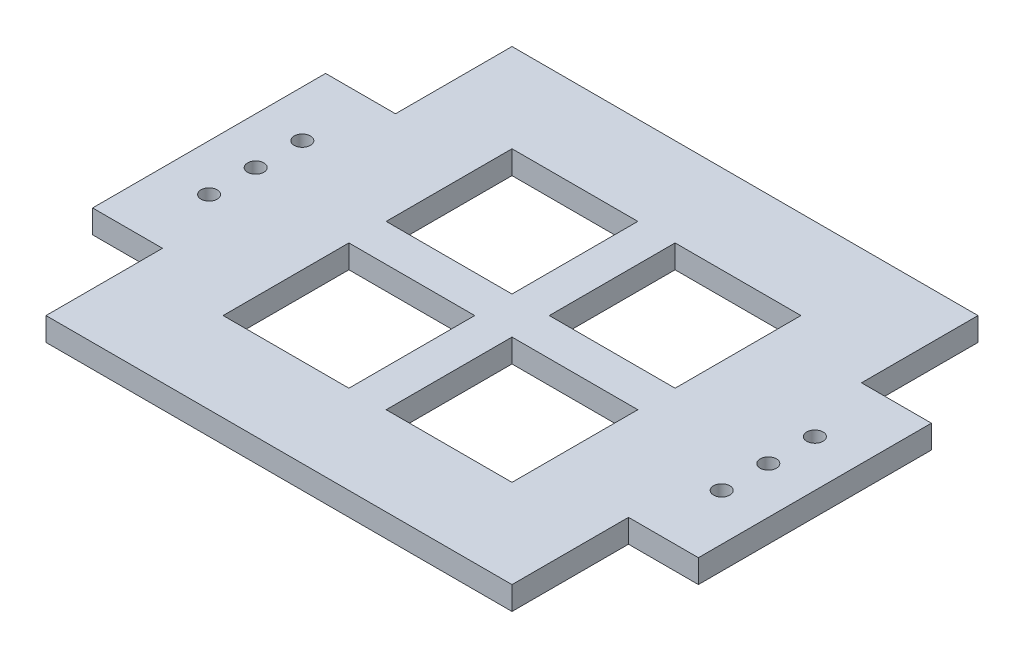
ISO-10303-21;
HEADER;
FILE_DESCRIPTION(('STEP AP214'),'2;1');
FILE_NAME('part.step','',(''),(''),'','','');
FILE_SCHEMA(('AUTOMOTIVE_DESIGN { 1 0 10303 214 1 1 1 1 }'));
ENDSEC;
DATA;
#1=APPLICATION_CONTEXT('core data for automotive mechanical design processes');
#2=APPLICATION_PROTOCOL_DEFINITION('international standard','automotive_design',2000,#1);
#3=PRODUCT_CONTEXT('',#1,'mechanical');
#4=PRODUCT('Part','Part','',(#3));
#5=PRODUCT_RELATED_PRODUCT_CATEGORY('part','',(#4));
#6=PRODUCT_DEFINITION_FORMATION('','',#4);
#7=PRODUCT_DEFINITION_CONTEXT('part definition',#1,'design');
#8=PRODUCT_DEFINITION('design','',#6,#7);
#9=PRODUCT_DEFINITION_SHAPE('','',#8);
#10=(LENGTH_UNIT() NAMED_UNIT(*) SI_UNIT(.MILLI.,.METRE.));
#11=(NAMED_UNIT(*) PLANE_ANGLE_UNIT() SI_UNIT($,.RADIAN.));
#12=(NAMED_UNIT(*) SI_UNIT($,.STERADIAN.) SOLID_ANGLE_UNIT());
#13=UNCERTAINTY_MEASURE_WITH_UNIT(LENGTH_MEASURE(1.E-05),#10,'distance_accuracy_value','');
#14=(GEOMETRIC_REPRESENTATION_CONTEXT(3) GLOBAL_UNCERTAINTY_ASSIGNED_CONTEXT((#13)) GLOBAL_UNIT_ASSIGNED_CONTEXT((#10,
#11,#12)) REPRESENTATION_CONTEXT('',''));
#15=CARTESIAN_POINT('',(0.,0.,0.));
#16=DIRECTION('',(0.,0.,1.));
#17=DIRECTION('',(1.,0.,0.));
#18=AXIS2_PLACEMENT_3D('',#15,#16,#17);
#19=CARTESIAN_POINT('',(0.,5.,0.));
#20=DIRECTION('',(0.,-1.,0.));
#21=DIRECTION('',(0.,0.,-1.));
#22=AXIS2_PLACEMENT_3D('',#19,#20,#21);
#23=PLANE('',#22);
#24=DIRECTION('',(0.,0.,-1.));
#25=VECTOR('',#24,1.);
#26=CARTESIAN_POINT('',(69.,5.,0.));
#27=LINE('',#26,#25);
#28=CARTESIAN_POINT('',(69.,5.,-19.));
#29=VERTEX_POINT('',#28);
#30=CARTESIAN_POINT('',(69.,5.,-46.));
#31=VERTEX_POINT('',#30);
#32=EDGE_CURVE('E285',#29,#31,#27,.T.);
#33=ORIENTED_EDGE('',*,*,#32,.T.);
#34=DIRECTION('',(1.,0.,0.));
#35=VECTOR('',#34,1.);
#36=CARTESIAN_POINT('',(0.,5.,-46.));
#37=LINE('',#36,#35);
#38=CARTESIAN_POINT('',(96.,5.,-46.));
#39=VERTEX_POINT('',#38);
#40=EDGE_CURVE('E340',#31,#39,#37,.T.);
#41=ORIENTED_EDGE('',*,*,#40,.T.);
#42=DIRECTION('',(0.,0.,-1.));
#43=VECTOR('',#42,1.);
#44=CARTESIAN_POINT('',(96.,5.,0.));
#45=LINE('',#44,#43);
#46=CARTESIAN_POINT('',(96.,5.,-19.));
#47=VERTEX_POINT('',#46);
#48=EDGE_CURVE('E354',#47,#39,#45,.T.);
#49=ORIENTED_EDGE('',*,*,#48,.F.);
#50=DIRECTION('',(1.,0.,0.));
#51=VECTOR('',#50,1.);
#52=CARTESIAN_POINT('',(0.,5.,-19.));
#53=LINE('',#52,#51);
#54=EDGE_CURVE('E351',#29,#47,#53,.T.);
#55=ORIENTED_EDGE('',*,*,#54,.F.);
#56=EDGE_LOOP('',(#33,#41,#49,#55));
#57=FACE_BOUND('',#56,.T.);
#58=CARTESIAN_POINT('',(155.,5.,-50.));
#59=DIRECTION('',(0.,1.,0.));
#60=DIRECTION('',(0.,0.,1.));
#61=AXIS2_PLACEMENT_3D('',#58,#59,#60);
#62=CIRCLE('',#61,1.75000000000001);
#63=CARTESIAN_POINT('',(155.,5.,-48.25));
#64=VERTEX_POINT('',#63);
#65=EDGE_CURVE('E433',#64,#64,#62,.T.);
#66=ORIENTED_EDGE('',*,*,#65,.F.);
#67=EDGE_LOOP('',(#66));
#68=FACE_BOUND('',#67,.T.);
#69=CARTESIAN_POINT('',(45.,5.,-50.));
#70=DIRECTION('',(0.,1.,0.));
#71=DIRECTION('',(0.,0.,1.));
#72=AXIS2_PLACEMENT_3D('',#69,#70,#71);
#73=CIRCLE('',#72,1.75);
#74=CARTESIAN_POINT('',(45.,5.,-48.25));
#75=VERTEX_POINT('',#74);
#76=EDGE_CURVE('E427',#75,#75,#73,.T.);
#77=ORIENTED_EDGE('',*,*,#76,.F.);
#78=EDGE_LOOP('',(#77));
#79=FACE_BOUND('',#78,.T.);
#80=CARTESIAN_POINT('',(45.,5.,-40.));
#81=DIRECTION('',(0.,-1.,0.));
#82=DIRECTION('',(0.,0.,-1.));
#83=AXIS2_PLACEMENT_3D('',#80,#81,#82);
#84=CIRCLE('',#83,1.75000000000001);
#85=CARTESIAN_POINT('',(45.,5.,-41.75));
#86=VERTEX_POINT('',#85);
#87=EDGE_CURVE('E460',#86,#86,#84,.T.);
#88=ORIENTED_EDGE('',*,*,#87,.T.);
#89=EDGE_LOOP('',(#88));
#90=FACE_BOUND('',#89,.T.);
#91=CARTESIAN_POINT('',(155.,5.,-40.));
#92=DIRECTION('',(0.,1.,0.));
#93=DIRECTION('',(0.,0.,1.));
#94=AXIS2_PLACEMENT_3D('',#91,#92,#93);
#95=CIRCLE('',#94,1.75000000000001);
#96=CARTESIAN_POINT('',(155.,5.,-38.25));
#97=VERTEX_POINT('',#96);
#98=EDGE_CURVE('E441',#97,#97,#95,.T.);
#99=ORIENTED_EDGE('',*,*,#98,.F.);
#100=EDGE_LOOP('',(#99));
#101=FACE_BOUND('',#100,.T.);
#102=CARTESIAN_POINT('',(155.,5.,-60.));
#103=DIRECTION('',(0.,1.,0.));
#104=DIRECTION('',(0.,0.,1.));
#105=AXIS2_PLACEMENT_3D('',#102,#103,#104);
#106=CIRCLE('',#105,1.75000000000001);
#107=CARTESIAN_POINT('',(155.,5.,-58.25));
#108=VERTEX_POINT('',#107);
#109=EDGE_CURVE('E448',#108,#108,#106,.F.);
#110=ORIENTED_EDGE('',*,*,#109,.T.);
#111=EDGE_LOOP('',(#110));
#112=FACE_BOUND('',#111,.T.);
#113=CARTESIAN_POINT('',(45.,5.,-60.));
#114=DIRECTION('',(0.,1.,0.));
#115=DIRECTION('',(0.,0.,1.));
#116=AXIS2_PLACEMENT_3D('',#113,#114,#115);
#117=CIRCLE('',#116,1.75000000000001);
#118=CARTESIAN_POINT('',(45.,5.,-58.25));
#119=VERTEX_POINT('',#118);
#120=EDGE_CURVE('E454',#119,#119,#117,.T.);
#121=ORIENTED_EDGE('',*,*,#120,.F.);
#122=EDGE_LOOP('',(#121));
#123=FACE_BOUND('',#122,.T.);
#124=DIRECTION('',(0.,0.,-1.));
#125=VECTOR('',#124,1.);
#126=CARTESIAN_POINT('',(104.,5.,0.));
#127=LINE('',#126,#125);
#128=CARTESIAN_POINT('',(104.,5.,-19.));
#129=VERTEX_POINT('',#128);
#130=CARTESIAN_POINT('',(104.,5.,-46.));
#131=VERTEX_POINT('',#130);
#132=EDGE_CURVE('E271',#129,#131,#127,.T.);
#133=ORIENTED_EDGE('',*,*,#132,.T.);
#134=DIRECTION('',(-1.,0.,0.));
#135=VECTOR('',#134,1.);
#136=CARTESIAN_POINT('',(0.,5.,-46.));
#137=LINE('',#136,#135);
#138=CARTESIAN_POINT('',(131.,5.,-46.));
#139=VERTEX_POINT('',#138);
#140=EDGE_CURVE('E262',#139,#131,#137,.T.);
#141=ORIENTED_EDGE('',*,*,#140,.F.);
#142=DIRECTION('',(0.,0.,-1.));
#143=VECTOR('',#142,1.);
#144=CARTESIAN_POINT('',(131.,5.,0.));
#145=LINE('',#144,#143);
#146=CARTESIAN_POINT('',(131.,5.,-19.));
#147=VERTEX_POINT('',#146);
#148=EDGE_CURVE('E278',#147,#139,#145,.T.);
#149=ORIENTED_EDGE('',*,*,#148,.F.);
#150=DIRECTION('',(-1.,0.,0.));
#151=VECTOR('',#150,1.);
#152=CARTESIAN_POINT('',(0.,5.,-19.));
#153=LINE('',#152,#151);
#154=EDGE_CURVE('E274',#147,#129,#153,.T.);
#155=ORIENTED_EDGE('',*,*,#154,.T.);
#156=EDGE_LOOP('',(#133,#141,#149,#155));
#157=FACE_BOUND('',#156,.T.);
#158=DIRECTION('',(1.,0.,0.));
#159=VECTOR('',#158,1.);
#160=CARTESIAN_POINT('',(0.,5.,-54.));
#161=LINE('',#160,#159);
#162=CARTESIAN_POINT('',(69.,5.,-54.));
#163=VERTEX_POINT('',#162);
#164=CARTESIAN_POINT('',(96.,5.,-54.));
#165=VERTEX_POINT('',#164);
#166=EDGE_CURVE('E399',#163,#165,#161,.T.);
#167=ORIENTED_EDGE('',*,*,#166,.F.);
#168=DIRECTION('',(0.,0.,1.));
#169=VECTOR('',#168,1.);
#170=CARTESIAN_POINT('',(69.,5.,0.));
#171=LINE('',#170,#169);
#172=CARTESIAN_POINT('',(69.,5.,-81.));
#173=VERTEX_POINT('',#172);
#174=EDGE_CURVE('E330',#173,#163,#171,.T.);
#175=ORIENTED_EDGE('',*,*,#174,.F.);
#176=DIRECTION('',(1.,0.,0.));
#177=VECTOR('',#176,1.);
#178=CARTESIAN_POINT('',(0.,5.,-81.));
#179=LINE('',#178,#177);
#180=CARTESIAN_POINT('',(96.,5.,-81.));
#181=VERTEX_POINT('',#180);
#182=EDGE_CURVE('E389',#173,#181,#179,.T.);
#183=ORIENTED_EDGE('',*,*,#182,.T.);
#184=DIRECTION('',(0.,0.,1.));
#185=VECTOR('',#184,1.);
#186=CARTESIAN_POINT('',(96.,5.,0.));
#187=LINE('',#186,#185);
#188=EDGE_CURVE('E402',#181,#165,#187,.T.);
#189=ORIENTED_EDGE('',*,*,#188,.T.);
#190=EDGE_LOOP('',(#167,#175,#183,#189));
#191=FACE_BOUND('',#190,.T.);
#192=DIRECTION('',(0.,0.,1.));
#193=VECTOR('',#192,1.);
#194=CARTESIAN_POINT('',(131.,5.,0.));
#195=LINE('',#194,#193);
#196=CARTESIAN_POINT('',(131.,5.,-81.));
#197=VERTEX_POINT('',#196);
#198=CARTESIAN_POINT('',(131.,5.,-54.));
#199=VERTEX_POINT('',#198);
#200=EDGE_CURVE('E315',#197,#199,#195,.T.);
#201=ORIENTED_EDGE('',*,*,#200,.T.);
#202=DIRECTION('',(-1.,0.,0.));
#203=VECTOR('',#202,1.);
#204=CARTESIAN_POINT('',(0.,5.,-54.));
#205=LINE('',#204,#203);
#206=CARTESIAN_POINT('',(104.,5.,-54.));
#207=VERTEX_POINT('',#206);
#208=EDGE_CURVE('E306',#199,#207,#205,.T.);
#209=ORIENTED_EDGE('',*,*,#208,.T.);
#210=DIRECTION('',(0.,0.,1.));
#211=VECTOR('',#210,1.);
#212=CARTESIAN_POINT('',(104.,5.,0.));
#213=LINE('',#212,#211);
#214=CARTESIAN_POINT('',(104.,5.,-81.));
#215=VERTEX_POINT('',#214);
#216=EDGE_CURVE('E322',#215,#207,#213,.T.);
#217=ORIENTED_EDGE('',*,*,#216,.F.);
#218=DIRECTION('',(-1.,0.,0.));
#219=VECTOR('',#218,1.);
#220=CARTESIAN_POINT('',(0.,5.,-81.));
#221=LINE('',#220,#219);
#222=EDGE_CURVE('E318',#197,#215,#221,.T.);
#223=ORIENTED_EDGE('',*,*,#222,.F.);
#224=EDGE_LOOP('',(#201,#209,#217,#223));
#225=FACE_BOUND('',#224,.T.);
#226=DIRECTION('',(0.,0.,-1.));
#227=VECTOR('',#226,1.);
#228=CARTESIAN_POINT('',(165.,5.,0.));
#229=LINE('',#228,#227);
#230=CARTESIAN_POINT('',(165.,5.,-25.));
#231=VERTEX_POINT('',#230);
#232=CARTESIAN_POINT('',(165.,5.,-75.));
#233=VERTEX_POINT('',#232);
#234=EDGE_CURVE('E54',#231,#233,#229,.T.);
#235=ORIENTED_EDGE('',*,*,#234,.T.);
#236=DIRECTION('',(-1.,0.,0.));
#237=VECTOR('',#236,1.);
#238=CARTESIAN_POINT('',(0.,5.,-75.));
#239=LINE('',#238,#237);
#240=CARTESIAN_POINT('',(150.,5.,-75.));
#241=VERTEX_POINT('',#240);
#242=EDGE_CURVE('E294',#233,#241,#239,.T.);
#243=ORIENTED_EDGE('',*,*,#242,.T.);
#244=DIRECTION('',(0.,0.,1.));
#245=VECTOR('',#244,1.);
#246=CARTESIAN_POINT('',(150.,5.,0.));
#247=LINE('',#246,#245);
#248=CARTESIAN_POINT('',(150.,5.,-100.));
#249=VERTEX_POINT('',#248);
#250=EDGE_CURVE('E257',#249,#241,#247,.T.);
#251=ORIENTED_EDGE('',*,*,#250,.F.);
#252=DIRECTION('',(-1.,0.,0.));
#253=VECTOR('',#252,1.);
#254=CARTESIAN_POINT('',(0.,5.,-100.));
#255=LINE('',#254,#253);
#256=CARTESIAN_POINT('',(50.,5.,-100.));
#257=VERTEX_POINT('',#256);
#258=EDGE_CURVE('E11',#249,#257,#255,.T.);
#259=ORIENTED_EDGE('',*,*,#258,.T.);
#260=DIRECTION('',(0.,0.,1.));
#261=VECTOR('',#260,1.);
#262=CARTESIAN_POINT('',(50.,5.,0.));
#263=LINE('',#262,#261);
#264=CARTESIAN_POINT('',(50.,5.,-75.));
#265=VERTEX_POINT('',#264);
#266=EDGE_CURVE('E374',#257,#265,#263,.T.);
#267=ORIENTED_EDGE('',*,*,#266,.T.);
#268=DIRECTION('',(1.,0.,0.));
#269=VECTOR('',#268,1.);
#270=CARTESIAN_POINT('',(0.,5.,-75.));
#271=LINE('',#270,#269);
#272=CARTESIAN_POINT('',(35.,5.,-75.));
#273=VERTEX_POINT('',#272);
#274=EDGE_CURVE('E371',#273,#265,#271,.T.);
#275=ORIENTED_EDGE('',*,*,#274,.F.);
#276=DIRECTION('',(0.,0.,-1.));
#277=VECTOR('',#276,1.);
#278=CARTESIAN_POINT('',(35.,5.,0.));
#279=LINE('',#278,#277);
#280=CARTESIAN_POINT('',(35.,5.,-25.));
#281=VERTEX_POINT('',#280);
#282=EDGE_CURVE('E488',#281,#273,#279,.T.);
#283=ORIENTED_EDGE('',*,*,#282,.F.);
#284=DIRECTION('',(1.,0.,0.));
#285=VECTOR('',#284,1.);
#286=CARTESIAN_POINT('',(0.,5.,-25.));
#287=LINE('',#286,#285);
#288=CARTESIAN_POINT('',(50.,5.,-25.));
#289=VERTEX_POINT('',#288);
#290=EDGE_CURVE('E382',#281,#289,#287,.T.);
#291=ORIENTED_EDGE('',*,*,#290,.T.);
#292=DIRECTION('',(0.,0.,-1.));
#293=VECTOR('',#292,1.);
#294=CARTESIAN_POINT('',(50.,5.,0.));
#295=LINE('',#294,#293);
#296=CARTESIAN_POINT('',(50.,5.,0.));
#297=VERTEX_POINT('',#296);
#298=EDGE_CURVE('E417',#297,#289,#295,.T.);
#299=ORIENTED_EDGE('',*,*,#298,.F.);
#300=DIRECTION('',(1.,0.,0.));
#301=VECTOR('',#300,1.);
#302=CARTESIAN_POINT('',(0.,5.,0.));
#303=LINE('',#302,#301);
#304=CARTESIAN_POINT('',(150.,5.,0.));
#305=VERTEX_POINT('',#304);
#306=EDGE_CURVE('E46',#297,#305,#303,.T.);
#307=ORIENTED_EDGE('',*,*,#306,.T.);
#308=DIRECTION('',(0.,0.,-1.));
#309=VECTOR('',#308,1.);
#310=CARTESIAN_POINT('',(150.,5.,0.));
#311=LINE('',#310,#309);
#312=CARTESIAN_POINT('',(150.,5.,-25.));
#313=VERTEX_POINT('',#312);
#314=EDGE_CURVE('E253',#305,#313,#311,.T.);
#315=ORIENTED_EDGE('',*,*,#314,.T.);
#316=DIRECTION('',(-1.,0.,0.));
#317=VECTOR('',#316,1.);
#318=CARTESIAN_POINT('',(0.,5.,-25.));
#319=LINE('',#318,#317);
#320=EDGE_CURVE('E249',#231,#313,#319,.T.);
#321=ORIENTED_EDGE('',*,*,#320,.F.);
#322=EDGE_LOOP('',(#235,#243,#251,#259,#267,#275,#283,#291,#299,#307,#315,#321));
#323=FACE_BOUND('',#322,.T.);
#324=ADVANCED_FACE('F37',(#57,#68,#79,#90,#101,#112,#123,#157,#191,#225,#323),#23,.F.);
#325=CARTESIAN_POINT('',(0.,0.,0.));
#326=DIRECTION('',(0.,-1.,0.));
#327=DIRECTION('',(0.,0.,-1.));
#328=AXIS2_PLACEMENT_3D('',#325,#326,#327);
#329=PLANE('',#328);
#330=DIRECTION('',(1.,0.,0.));
#331=VECTOR('',#330,1.);
#332=CARTESIAN_POINT('',(0.,0.,-46.));
#333=LINE('',#332,#331);
#334=CARTESIAN_POINT('',(69.,0.,-46.));
#335=VERTEX_POINT('',#334);
#336=CARTESIAN_POINT('',(96.,0.,-46.));
#337=VERTEX_POINT('',#336);
#338=EDGE_CURVE('E346',#335,#337,#333,.T.);
#339=ORIENTED_EDGE('',*,*,#338,.F.);
#340=DIRECTION('',(0.,0.,-1.));
#341=VECTOR('',#340,1.);
#342=CARTESIAN_POINT('',(69.,0.,0.));
#343=LINE('',#342,#341);
#344=CARTESIAN_POINT('',(69.,0.,-19.));
#345=VERTEX_POINT('',#344);
#346=EDGE_CURVE('E337',#345,#335,#343,.T.);
#347=ORIENTED_EDGE('',*,*,#346,.F.);
#348=DIRECTION('',(1.,0.,0.));
#349=VECTOR('',#348,1.);
#350=CARTESIAN_POINT('',(0.,0.,-19.));
#351=LINE('',#350,#349);
#352=CARTESIAN_POINT('',(96.,0.,-19.));
#353=VERTEX_POINT('',#352);
#354=EDGE_CURVE('E339',#345,#353,#351,.T.);
#355=ORIENTED_EDGE('',*,*,#354,.T.);
#356=DIRECTION('',(0.,0.,-1.));
#357=VECTOR('',#356,1.);
#358=CARTESIAN_POINT('',(96.,0.,0.));
#359=LINE('',#358,#357);
#360=EDGE_CURVE('E343',#353,#337,#359,.T.);
#361=ORIENTED_EDGE('',*,*,#360,.T.);
#362=EDGE_LOOP('',(#339,#347,#355,#361));
#363=FACE_BOUND('',#362,.T.);
#364=DIRECTION('',(-1.,0.,0.));
#365=VECTOR('',#364,1.);
#366=CARTESIAN_POINT('',(0.,0.,-54.));
#367=LINE('',#366,#365);
#368=CARTESIAN_POINT('',(131.,0.,-54.));
#369=VERTEX_POINT('',#368);
#370=CARTESIAN_POINT('',(104.,0.,-54.));
#371=VERTEX_POINT('',#370);
#372=EDGE_CURVE('E312',#369,#371,#367,.T.);
#373=ORIENTED_EDGE('',*,*,#372,.F.);
#374=DIRECTION('',(0.,0.,1.));
#375=VECTOR('',#374,1.);
#376=CARTESIAN_POINT('',(131.,0.,0.));
#377=LINE('',#376,#375);
#378=CARTESIAN_POINT('',(131.,0.,-81.));
#379=VERTEX_POINT('',#378);
#380=EDGE_CURVE('E303',#379,#369,#377,.T.);
#381=ORIENTED_EDGE('',*,*,#380,.F.);
#382=DIRECTION('',(-1.,0.,0.));
#383=VECTOR('',#382,1.);
#384=CARTESIAN_POINT('',(0.,0.,-81.));
#385=LINE('',#384,#383);
#386=CARTESIAN_POINT('',(104.,0.,-81.));
#387=VERTEX_POINT('',#386);
#388=EDGE_CURVE('E305',#379,#387,#385,.T.);
#389=ORIENTED_EDGE('',*,*,#388,.T.);
#390=DIRECTION('',(0.,0.,1.));
#391=VECTOR('',#390,1.);
#392=CARTESIAN_POINT('',(104.,0.,0.));
#393=LINE('',#392,#391);
#394=EDGE_CURVE('E309',#387,#371,#393,.T.);
#395=ORIENTED_EDGE('',*,*,#394,.T.);
#396=EDGE_LOOP('',(#373,#381,#389,#395));
#397=FACE_BOUND('',#396,.T.);
#398=DIRECTION('',(-1.,0.,0.));
#399=VECTOR('',#398,1.);
#400=CARTESIAN_POINT('',(0.,0.,-46.));
#401=LINE('',#400,#399);
#402=CARTESIAN_POINT('',(131.,0.,-46.));
#403=VERTEX_POINT('',#402);
#404=CARTESIAN_POINT('',(104.,0.,-46.));
#405=VERTEX_POINT('',#404);
#406=EDGE_CURVE('E267',#403,#405,#401,.T.);
#407=ORIENTED_EDGE('',*,*,#406,.T.);
#408=DIRECTION('',(0.,0.,-1.));
#409=VECTOR('',#408,1.);
#410=CARTESIAN_POINT('',(104.,0.,0.));
#411=LINE('',#410,#409);
#412=CARTESIAN_POINT('',(104.,0.,-19.));
#413=VERTEX_POINT('',#412);
#414=EDGE_CURVE('E259',#413,#405,#411,.T.);
#415=ORIENTED_EDGE('',*,*,#414,.F.);
#416=DIRECTION('',(-1.,0.,0.));
#417=VECTOR('',#416,1.);
#418=CARTESIAN_POINT('',(0.,0.,-19.));
#419=LINE('',#418,#417);
#420=CARTESIAN_POINT('',(131.,0.,-19.));
#421=VERTEX_POINT('',#420);
#422=EDGE_CURVE('E261',#421,#413,#419,.T.);
#423=ORIENTED_EDGE('',*,*,#422,.F.);
#424=DIRECTION('',(0.,0.,-1.));
#425=VECTOR('',#424,1.);
#426=CARTESIAN_POINT('',(131.,0.,0.));
#427=LINE('',#426,#425);
#428=EDGE_CURVE('E264',#421,#403,#427,.T.);
#429=ORIENTED_EDGE('',*,*,#428,.T.);
#430=EDGE_LOOP('',(#407,#415,#423,#429));
#431=FACE_BOUND('',#430,.T.);
#432=CARTESIAN_POINT('',(45.,0.,-60.));
#433=DIRECTION('',(0.,1.,0.));
#434=DIRECTION('',(0.,0.,1.));
#435=AXIS2_PLACEMENT_3D('',#432,#433,#434);
#436=CIRCLE('',#435,1.75000000000001);
#437=CARTESIAN_POINT('',(45.,0.,-58.25));
#438=VERTEX_POINT('',#437);
#439=EDGE_CURVE('E457',#438,#438,#436,.T.);
#440=ORIENTED_EDGE('',*,*,#439,.T.);
#441=EDGE_LOOP('',(#440));
#442=FACE_BOUND('',#441,.T.);
#443=CARTESIAN_POINT('',(155.,0.,-40.));
#444=DIRECTION('',(0.,1.,0.));
#445=DIRECTION('',(0.,0.,1.));
#446=AXIS2_PLACEMENT_3D('',#443,#444,#445);
#447=CIRCLE('',#446,1.75000000000001);
#448=CARTESIAN_POINT('',(155.,0.,-38.25));
#449=VERTEX_POINT('',#448);
#450=EDGE_CURVE('E445',#449,#449,#447,.T.);
#451=ORIENTED_EDGE('',*,*,#450,.T.);
#452=EDGE_LOOP('',(#451));
#453=FACE_BOUND('',#452,.T.);
#454=CARTESIAN_POINT('',(155.,0.,-60.));
#455=DIRECTION('',(0.,1.,0.));
#456=DIRECTION('',(0.,0.,1.));
#457=AXIS2_PLACEMENT_3D('',#454,#455,#456);
#458=CIRCLE('',#457,1.75000000000001);
#459=CARTESIAN_POINT('',(155.,0.,-58.25));
#460=VERTEX_POINT('',#459);
#461=EDGE_CURVE('E451',#460,#460,#458,.F.);
#462=ORIENTED_EDGE('',*,*,#461,.F.);
#463=EDGE_LOOP('',(#462));
#464=FACE_BOUND('',#463,.T.);
#465=CARTESIAN_POINT('',(45.,0.,-40.));
#466=DIRECTION('',(0.,-1.,0.));
#467=DIRECTION('',(0.,0.,-1.));
#468=AXIS2_PLACEMENT_3D('',#465,#466,#467);
#469=CIRCLE('',#468,1.75000000000001);
#470=CARTESIAN_POINT('',(45.,0.,-41.75));
#471=VERTEX_POINT('',#470);
#472=EDGE_CURVE('E432',#471,#471,#469,.T.);
#473=ORIENTED_EDGE('',*,*,#472,.F.);
#474=EDGE_LOOP('',(#473));
#475=FACE_BOUND('',#474,.T.);
#476=CARTESIAN_POINT('',(45.,0.,-50.));
#477=DIRECTION('',(0.,1.,0.));
#478=DIRECTION('',(0.,0.,1.));
#479=AXIS2_PLACEMENT_3D('',#476,#477,#478);
#480=CIRCLE('',#479,1.75);
#481=CARTESIAN_POINT('',(45.,0.,-48.25));
#482=VERTEX_POINT('',#481);
#483=EDGE_CURVE('E436',#482,#482,#480,.T.);
#484=ORIENTED_EDGE('',*,*,#483,.T.);
#485=EDGE_LOOP('',(#484));
#486=FACE_BOUND('',#485,.T.);
#487=CARTESIAN_POINT('',(155.,0.,-50.));
#488=DIRECTION('',(0.,1.,0.));
#489=DIRECTION('',(0.,0.,1.));
#490=AXIS2_PLACEMENT_3D('',#487,#488,#489);
#491=CIRCLE('',#490,1.75000000000001);
#492=CARTESIAN_POINT('',(155.,0.,-48.25));
#493=VERTEX_POINT('',#492);
#494=EDGE_CURVE('E429',#493,#493,#491,.T.);
#495=ORIENTED_EDGE('',*,*,#494,.T.);
#496=EDGE_LOOP('',(#495));
#497=FACE_BOUND('',#496,.T.);
#498=DIRECTION('',(0.,0.,1.));
#499=VECTOR('',#498,1.);
#500=CARTESIAN_POINT('',(69.,0.,0.));
#501=LINE('',#500,#499);
#502=CARTESIAN_POINT('',(69.,0.,-81.));
#503=VERTEX_POINT('',#502);
#504=CARTESIAN_POINT('',(69.,0.,-54.));
#505=VERTEX_POINT('',#504);
#506=EDGE_CURVE('E385',#503,#505,#501,.T.);
#507=ORIENTED_EDGE('',*,*,#506,.T.);
#508=DIRECTION('',(1.,0.,0.));
#509=VECTOR('',#508,1.);
#510=CARTESIAN_POINT('',(0.,0.,-54.));
#511=LINE('',#510,#509);
#512=CARTESIAN_POINT('',(96.,0.,-54.));
#513=VERTEX_POINT('',#512);
#514=EDGE_CURVE('E388',#505,#513,#511,.T.);
#515=ORIENTED_EDGE('',*,*,#514,.T.);
#516=DIRECTION('',(0.,0.,1.));
#517=VECTOR('',#516,1.);
#518=CARTESIAN_POINT('',(96.,0.,0.));
#519=LINE('',#518,#517);
#520=CARTESIAN_POINT('',(96.,0.,-81.));
#521=VERTEX_POINT('',#520);
#522=EDGE_CURVE('E392',#521,#513,#519,.T.);
#523=ORIENTED_EDGE('',*,*,#522,.F.);
#524=DIRECTION('',(1.,0.,0.));
#525=VECTOR('',#524,1.);
#526=CARTESIAN_POINT('',(0.,0.,-81.));
#527=LINE('',#526,#525);
#528=EDGE_CURVE('E395',#503,#521,#527,.T.);
#529=ORIENTED_EDGE('',*,*,#528,.F.);
#530=EDGE_LOOP('',(#507,#515,#523,#529));
#531=FACE_BOUND('',#530,.T.);
#532=DIRECTION('',(-1.,0.,0.));
#533=VECTOR('',#532,1.);
#534=CARTESIAN_POINT('',(0.,0.,-75.));
#535=LINE('',#534,#533);
#536=CARTESIAN_POINT('',(165.,0.,-75.));
#537=VERTEX_POINT('',#536);
#538=CARTESIAN_POINT('',(150.,0.,-75.));
#539=VERTEX_POINT('',#538);
#540=EDGE_CURVE('E238',#537,#539,#535,.T.);
#541=ORIENTED_EDGE('',*,*,#540,.F.);
#542=DIRECTION('',(0.,0.,-1.));
#543=VECTOR('',#542,1.);
#544=CARTESIAN_POINT('',(165.,0.,0.));
#545=LINE('',#544,#543);
#546=CARTESIAN_POINT('',(165.,0.,-25.));
#547=VERTEX_POINT('',#546);
#548=EDGE_CURVE('E224',#547,#537,#545,.T.);
#549=ORIENTED_EDGE('',*,*,#548,.F.);
#550=DIRECTION('',(-1.,0.,0.));
#551=VECTOR('',#550,1.);
#552=CARTESIAN_POINT('',(0.,0.,-25.));
#553=LINE('',#552,#551);
#554=CARTESIAN_POINT('',(150.,0.,-25.));
#555=VERTEX_POINT('',#554);
#556=EDGE_CURVE('E235',#547,#555,#553,.T.);
#557=ORIENTED_EDGE('',*,*,#556,.T.);
#558=DIRECTION('',(0.,0.,-1.));
#559=VECTOR('',#558,1.);
#560=CARTESIAN_POINT('',(150.,0.,0.));
#561=LINE('',#560,#559);
#562=CARTESIAN_POINT('',(150.,0.,0.));
#563=VERTEX_POINT('',#562);
#564=EDGE_CURVE('E245',#563,#555,#561,.T.);
#565=ORIENTED_EDGE('',*,*,#564,.F.);
#566=DIRECTION('',(1.,0.,0.));
#567=VECTOR('',#566,1.);
#568=CARTESIAN_POINT('',(0.,0.,0.));
#569=LINE('',#568,#567);
#570=CARTESIAN_POINT('',(50.,0.,0.));
#571=VERTEX_POINT('',#570);
#572=EDGE_CURVE('E444',#571,#563,#569,.T.);
#573=ORIENTED_EDGE('',*,*,#572,.F.);
#574=DIRECTION('',(0.,0.,-1.));
#575=VECTOR('',#574,1.);
#576=CARTESIAN_POINT('',(50.,0.,0.));
#577=LINE('',#576,#575);
#578=CARTESIAN_POINT('',(50.,0.,-25.));
#579=VERTEX_POINT('',#578);
#580=EDGE_CURVE('E416',#571,#579,#577,.T.);
#581=ORIENTED_EDGE('',*,*,#580,.T.);
#582=DIRECTION('',(1.,0.,0.));
#583=VECTOR('',#582,1.);
#584=CARTESIAN_POINT('',(0.,0.,-25.));
#585=LINE('',#584,#583);
#586=CARTESIAN_POINT('',(35.,0.,-25.));
#587=VERTEX_POINT('',#586);
#588=EDGE_CURVE('E414',#587,#579,#585,.T.);
#589=ORIENTED_EDGE('',*,*,#588,.F.);
#590=DIRECTION('',(0.,0.,-1.));
#591=VECTOR('',#590,1.);
#592=CARTESIAN_POINT('',(35.,0.,0.));
#593=LINE('',#592,#591);
#594=CARTESIAN_POINT('',(35.,0.,-75.));
#595=VERTEX_POINT('',#594);
#596=EDGE_CURVE('E62',#587,#595,#593,.T.);
#597=ORIENTED_EDGE('',*,*,#596,.T.);
#598=DIRECTION('',(1.,0.,0.));
#599=VECTOR('',#598,1.);
#600=CARTESIAN_POINT('',(0.,0.,-75.));
#601=LINE('',#600,#599);
#602=CARTESIAN_POINT('',(50.,0.,-75.));
#603=VERTEX_POINT('',#602);
#604=EDGE_CURVE('E370',#595,#603,#601,.T.);
#605=ORIENTED_EDGE('',*,*,#604,.T.);
#606=DIRECTION('',(0.,0.,1.));
#607=VECTOR('',#606,1.);
#608=CARTESIAN_POINT('',(50.,0.,0.));
#609=LINE('',#608,#607);
#610=CARTESIAN_POINT('',(50.,0.,-100.));
#611=VERTEX_POINT('',#610);
#612=EDGE_CURVE('E367',#611,#603,#609,.T.);
#613=ORIENTED_EDGE('',*,*,#612,.F.);
#614=DIRECTION('',(-1.,0.,0.));
#615=VECTOR('',#614,1.);
#616=CARTESIAN_POINT('',(0.,0.,-100.));
#617=LINE('',#616,#615);
#618=CARTESIAN_POINT('',(150.,0.,-100.));
#619=VERTEX_POINT('',#618);
#620=EDGE_CURVE('E41',#619,#611,#617,.T.);
#621=ORIENTED_EDGE('',*,*,#620,.F.);
#622=DIRECTION('',(0.,0.,1.));
#623=VECTOR('',#622,1.);
#624=CARTESIAN_POINT('',(150.,0.,0.));
#625=LINE('',#624,#623);
#626=EDGE_CURVE('E292',#619,#539,#625,.T.);
#627=ORIENTED_EDGE('',*,*,#626,.T.);
#628=EDGE_LOOP('',(#541,#549,#557,#565,#573,#581,#589,#597,#605,#613,#621,#627));
#629=FACE_BOUND('',#628,.T.);
#630=ADVANCED_FACE('F233',(#363,#397,#431,#442,#453,#464,#475,#486,#497,#531,#629),#329,.T.);
#631=CARTESIAN_POINT('',(0.,0.,-75.));
#632=DIRECTION('',(0.,0.,-1.));
#633=DIRECTION('',(-1.,0.,0.));
#634=AXIS2_PLACEMENT_3D('',#631,#632,#633);
#635=PLANE('',#634);
#636=ORIENTED_EDGE('',*,*,#242,.F.);
#637=DIRECTION('',(0.,1.,0.));
#638=VECTOR('',#637,1.);
#639=CARTESIAN_POINT('',(165.,0.,-75.));
#640=LINE('',#639,#638);
#641=EDGE_CURVE('E229',#537,#233,#640,.T.);
#642=ORIENTED_EDGE('',*,*,#641,.F.);
#643=ORIENTED_EDGE('',*,*,#540,.T.);
#644=DIRECTION('',(0.,1.,0.));
#645=VECTOR('',#644,1.);
#646=CARTESIAN_POINT('',(150.,0.,-75.));
#647=LINE('',#646,#645);
#648=EDGE_CURVE('E275',#539,#241,#647,.T.);
#649=ORIENTED_EDGE('',*,*,#648,.T.);
#650=EDGE_LOOP('',(#636,#642,#643,#649));
#651=FACE_BOUND('',#650,.T.);
#652=ADVANCED_FACE('F496',(#651),#635,.T.);
#653=CARTESIAN_POINT('',(0.,0.,-25.));
#654=DIRECTION('',(0.,0.,-1.));
#655=DIRECTION('',(-1.,0.,0.));
#656=AXIS2_PLACEMENT_3D('',#653,#654,#655);
#657=PLANE('',#656);
#658=DIRECTION('',(0.,1.,0.));
#659=VECTOR('',#658,1.);
#660=CARTESIAN_POINT('',(165.,0.,-25.));
#661=LINE('',#660,#659);
#662=EDGE_CURVE('E221',#547,#231,#661,.T.);
#663=ORIENTED_EDGE('',*,*,#662,.T.);
#664=ORIENTED_EDGE('',*,*,#320,.T.);
#665=DIRECTION('',(0.,1.,0.));
#666=VECTOR('',#665,1.);
#667=CARTESIAN_POINT('',(150.,0.,-25.));
#668=LINE('',#667,#666);
#669=EDGE_CURVE('E243',#555,#313,#668,.T.);
#670=ORIENTED_EDGE('',*,*,#669,.F.);
#671=ORIENTED_EDGE('',*,*,#556,.F.);
#672=EDGE_LOOP('',(#663,#664,#670,#671));
#673=FACE_BOUND('',#672,.T.);
#674=ADVANCED_FACE('F241',(#673),#657,.F.);
#675=CARTESIAN_POINT('',(0.,5.,0.));
#676=DIRECTION('',(0.,0.,-1.));
#677=DIRECTION('',(-1.,0.,0.));
#678=AXIS2_PLACEMENT_3D('',#675,#676,#677);
#679=PLANE('',#678);
#680=DIRECTION('',(0.,1.,0.));
#681=VECTOR('',#680,1.);
#682=CARTESIAN_POINT('',(150.,0.,0.));
#683=LINE('',#682,#681);
#684=EDGE_CURVE('E244',#563,#305,#683,.T.);
#685=ORIENTED_EDGE('',*,*,#684,.T.);
#686=ORIENTED_EDGE('',*,*,#306,.F.);
#687=DIRECTION('',(0.,1.,0.));
#688=VECTOR('',#687,1.);
#689=CARTESIAN_POINT('',(50.,0.,0.));
#690=LINE('',#689,#688);
#691=EDGE_CURVE('E420',#571,#297,#690,.T.);
#692=ORIENTED_EDGE('',*,*,#691,.F.);
#693=ORIENTED_EDGE('',*,*,#572,.T.);
#694=EDGE_LOOP('',(#685,#686,#692,#693));
#695=FACE_BOUND('',#694,.T.);
#696=ADVANCED_FACE('F39',(#695),#679,.F.);
#697=CARTESIAN_POINT('',(0.,5.,-100.));
#698=DIRECTION('',(0.,0.,1.));
#699=DIRECTION('',(1.,0.,0.));
#700=AXIS2_PLACEMENT_3D('',#697,#698,#699);
#701=PLANE('',#700);
#702=DIRECTION('',(0.,1.,0.));
#703=VECTOR('',#702,1.);
#704=CARTESIAN_POINT('',(50.,0.,-100.));
#705=LINE('',#704,#703);
#706=EDGE_CURVE('E373',#611,#257,#705,.T.);
#707=ORIENTED_EDGE('',*,*,#706,.T.);
#708=ORIENTED_EDGE('',*,*,#258,.F.);
#709=DIRECTION('',(0.,1.,0.));
#710=VECTOR('',#709,1.);
#711=CARTESIAN_POINT('',(150.,0.,-100.));
#712=LINE('',#711,#710);
#713=EDGE_CURVE('E296',#619,#249,#712,.T.);
#714=ORIENTED_EDGE('',*,*,#713,.F.);
#715=ORIENTED_EDGE('',*,*,#620,.T.);
#716=EDGE_LOOP('',(#707,#708,#714,#715));
#717=FACE_BOUND('',#716,.T.);
#718=ADVANCED_FACE('F474',(#717),#701,.F.);
#719=CARTESIAN_POINT('',(155.,0.,-40.));
#720=DIRECTION('',(0.,1.,0.));
#721=DIRECTION('',(0.,0.,1.));
#722=AXIS2_PLACEMENT_3D('',#719,#720,#721);
#723=CYLINDRICAL_SURFACE('',#722,1.75000000000001);
#724=ORIENTED_EDGE('',*,*,#450,.F.);
#725=EDGE_LOOP('',(#724));
#726=FACE_BOUND('',#725,.T.);
#727=ORIENTED_EDGE('',*,*,#98,.T.);
#728=EDGE_LOOP('',(#727));
#729=FACE_BOUND('',#728,.T.);
#730=ADVANCED_FACE('F537',(#726,#729),#723,.F.);
#731=CARTESIAN_POINT('',(155.,0.,-60.));
#732=DIRECTION('',(0.,1.,0.));
#733=DIRECTION('',(0.,0.,1.));
#734=AXIS2_PLACEMENT_3D('',#731,#732,#733);
#735=CYLINDRICAL_SURFACE('',#734,1.75000000000001);
#736=ORIENTED_EDGE('',*,*,#461,.T.);
#737=EDGE_LOOP('',(#736));
#738=FACE_BOUND('',#737,.T.);
#739=ORIENTED_EDGE('',*,*,#109,.F.);
#740=EDGE_LOOP('',(#739));
#741=FACE_BOUND('',#740,.T.);
#742=ADVANCED_FACE('F542',(#738,#741),#735,.F.);
#743=CARTESIAN_POINT('',(45.,0.,-60.));
#744=DIRECTION('',(0.,1.,0.));
#745=DIRECTION('',(0.,0.,1.));
#746=AXIS2_PLACEMENT_3D('',#743,#744,#745);
#747=CYLINDRICAL_SURFACE('',#746,1.75000000000001);
#748=ORIENTED_EDGE('',*,*,#439,.F.);
#749=EDGE_LOOP('',(#748));
#750=FACE_BOUND('',#749,.T.);
#751=ORIENTED_EDGE('',*,*,#120,.T.);
#752=EDGE_LOOP('',(#751));
#753=FACE_BOUND('',#752,.T.);
#754=ADVANCED_FACE('F800',(#750,#753),#747,.F.);
#755=CARTESIAN_POINT('',(45.,0.,-40.));
#756=DIRECTION('',(0.,1.,0.));
#757=DIRECTION('',(0.,0.,1.));
#758=AXIS2_PLACEMENT_3D('',#755,#756,#757);
#759=CYLINDRICAL_SURFACE('',#758,1.75000000000001);
#760=ORIENTED_EDGE('',*,*,#472,.T.);
#761=EDGE_LOOP('',(#760));
#762=FACE_BOUND('',#761,.T.);
#763=ORIENTED_EDGE('',*,*,#87,.F.);
#764=EDGE_LOOP('',(#763));
#765=FACE_BOUND('',#764,.T.);
#766=ADVANCED_FACE('F534',(#762,#765),#759,.F.);
#767=CARTESIAN_POINT('',(45.,0.,-50.));
#768=DIRECTION('',(0.,1.,0.));
#769=DIRECTION('',(0.,0.,1.));
#770=AXIS2_PLACEMENT_3D('',#767,#768,#769);
#771=CYLINDRICAL_SURFACE('',#770,1.75);
#772=ORIENTED_EDGE('',*,*,#483,.F.);
#773=EDGE_LOOP('',(#772));
#774=FACE_BOUND('',#773,.T.);
#775=ORIENTED_EDGE('',*,*,#76,.T.);
#776=EDGE_LOOP('',(#775));
#777=FACE_BOUND('',#776,.T.);
#778=ADVANCED_FACE('F785',(#774,#777),#771,.F.);
#779=CARTESIAN_POINT('',(155.,0.,-50.));
#780=DIRECTION('',(0.,1.,0.));
#781=DIRECTION('',(0.,0.,1.));
#782=AXIS2_PLACEMENT_3D('',#779,#780,#781);
#783=CYLINDRICAL_SURFACE('',#782,1.75000000000001);
#784=ORIENTED_EDGE('',*,*,#494,.F.);
#785=EDGE_LOOP('',(#784));
#786=FACE_BOUND('',#785,.T.);
#787=ORIENTED_EDGE('',*,*,#65,.T.);
#788=EDGE_LOOP('',(#787));
#789=FACE_BOUND('',#788,.T.);
#790=ADVANCED_FACE('F778',(#786,#789),#783,.F.);
#791=CARTESIAN_POINT('',(150.,0.,0.));
#792=DIRECTION('',(-1.,0.,0.));
#793=DIRECTION('',(0.,0.,1.));
#794=AXIS2_PLACEMENT_3D('',#791,#792,#793);
#795=PLANE('',#794);
#796=ORIENTED_EDGE('',*,*,#250,.T.);
#797=ORIENTED_EDGE('',*,*,#648,.F.);
#798=ORIENTED_EDGE('',*,*,#626,.F.);
#799=ORIENTED_EDGE('',*,*,#713,.T.);
#800=EDGE_LOOP('',(#796,#797,#798,#799));
#801=FACE_BOUND('',#800,.T.);
#802=ADVANCED_FACE('F494',(#801),#795,.F.);
#803=CARTESIAN_POINT('',(50.,0.,0.));
#804=DIRECTION('',(-1.,0.,0.));
#805=DIRECTION('',(0.,0.,1.));
#806=AXIS2_PLACEMENT_3D('',#803,#804,#805);
#807=PLANE('',#806);
#808=ORIENTED_EDGE('',*,*,#266,.F.);
#809=ORIENTED_EDGE('',*,*,#706,.F.);
#810=ORIENTED_EDGE('',*,*,#612,.T.);
#811=DIRECTION('',(0.,1.,0.));
#812=VECTOR('',#811,1.);
#813=CARTESIAN_POINT('',(50.,0.,-75.));
#814=LINE('',#813,#812);
#815=EDGE_CURVE('E379',#603,#265,#814,.T.);
#816=ORIENTED_EDGE('',*,*,#815,.T.);
#817=EDGE_LOOP('',(#808,#809,#810,#816));
#818=FACE_BOUND('',#817,.T.);
#819=ADVANCED_FACE('F480',(#818),#807,.T.);
#820=CARTESIAN_POINT('',(0.,0.,-75.));
#821=DIRECTION('',(0.,0.,1.));
#822=DIRECTION('',(1.,0.,0.));
#823=AXIS2_PLACEMENT_3D('',#820,#821,#822);
#824=PLANE('',#823);
#825=ORIENTED_EDGE('',*,*,#604,.F.);
#826=DIRECTION('',(0.,1.,0.));
#827=VECTOR('',#826,1.);
#828=CARTESIAN_POINT('',(35.,0.,-75.));
#829=LINE('',#828,#827);
#830=EDGE_CURVE('E485',#595,#273,#829,.T.);
#831=ORIENTED_EDGE('',*,*,#830,.T.);
#832=ORIENTED_EDGE('',*,*,#274,.T.);
#833=ORIENTED_EDGE('',*,*,#815,.F.);
#834=EDGE_LOOP('',(#825,#831,#832,#833));
#835=FACE_BOUND('',#834,.T.);
#836=ADVANCED_FACE('F482',(#835),#824,.F.);
#837=CARTESIAN_POINT('',(150.,0.,0.));
#838=DIRECTION('',(1.,0.,0.));
#839=DIRECTION('',(0.,0.,-1.));
#840=AXIS2_PLACEMENT_3D('',#837,#838,#839);
#841=PLANE('',#840);
#842=ORIENTED_EDGE('',*,*,#314,.F.);
#843=ORIENTED_EDGE('',*,*,#684,.F.);
#844=ORIENTED_EDGE('',*,*,#564,.T.);
#845=ORIENTED_EDGE('',*,*,#669,.T.);
#846=EDGE_LOOP('',(#842,#843,#844,#845));
#847=FACE_BOUND('',#846,.T.);
#848=ADVANCED_FACE('F513',(#847),#841,.T.);
#849=CARTESIAN_POINT('',(0.,0.,-25.));
#850=DIRECTION('',(0.,0.,1.));
#851=DIRECTION('',(1.,0.,0.));
#852=AXIS2_PLACEMENT_3D('',#849,#850,#851);
#853=PLANE('',#852);
#854=DIRECTION('',(0.,1.,0.));
#855=VECTOR('',#854,1.);
#856=CARTESIAN_POINT('',(35.,0.,-25.));
#857=LINE('',#856,#855);
#858=EDGE_CURVE('E501',#587,#281,#857,.T.);
#859=ORIENTED_EDGE('',*,*,#858,.F.);
#860=ORIENTED_EDGE('',*,*,#588,.T.);
#861=DIRECTION('',(0.,1.,0.));
#862=VECTOR('',#861,1.);
#863=CARTESIAN_POINT('',(50.,0.,-25.));
#864=LINE('',#863,#862);
#865=EDGE_CURVE('E424',#579,#289,#864,.T.);
#866=ORIENTED_EDGE('',*,*,#865,.T.);
#867=ORIENTED_EDGE('',*,*,#290,.F.);
#868=EDGE_LOOP('',(#859,#860,#866,#867));
#869=FACE_BOUND('',#868,.T.);
#870=ADVANCED_FACE('F506',(#869),#853,.T.);
#871=CARTESIAN_POINT('',(50.,0.,0.));
#872=DIRECTION('',(1.,0.,0.));
#873=DIRECTION('',(0.,0.,-1.));
#874=AXIS2_PLACEMENT_3D('',#871,#872,#873);
#875=PLANE('',#874);
#876=ORIENTED_EDGE('',*,*,#298,.T.);
#877=ORIENTED_EDGE('',*,*,#865,.F.);
#878=ORIENTED_EDGE('',*,*,#580,.F.);
#879=ORIENTED_EDGE('',*,*,#691,.T.);
#880=EDGE_LOOP('',(#876,#877,#878,#879));
#881=FACE_BOUND('',#880,.T.);
#882=ADVANCED_FACE('F509',(#881),#875,.F.);
#883=CARTESIAN_POINT('',(104.,0.,0.));
#884=DIRECTION('',(1.,0.,0.));
#885=DIRECTION('',(0.,0.,-1.));
#886=AXIS2_PLACEMENT_3D('',#883,#884,#885);
#887=PLANE('',#886);
#888=ORIENTED_EDGE('',*,*,#132,.F.);
#889=DIRECTION('',(0.,1.,0.));
#890=VECTOR('',#889,1.);
#891=CARTESIAN_POINT('',(104.,0.,-19.));
#892=LINE('',#891,#890);
#893=EDGE_CURVE('E270',#413,#129,#892,.T.);
#894=ORIENTED_EDGE('',*,*,#893,.F.);
#895=ORIENTED_EDGE('',*,*,#414,.T.);
#896=DIRECTION('',(0.,1.,0.));
#897=VECTOR('',#896,1.);
#898=CARTESIAN_POINT('',(104.,0.,-46.));
#899=LINE('',#898,#897);
#900=EDGE_CURVE('E283',#405,#131,#899,.T.);
#901=ORIENTED_EDGE('',*,*,#900,.T.);
#902=EDGE_LOOP('',(#888,#894,#895,#901));
#903=FACE_BOUND('',#902,.T.);
#904=ADVANCED_FACE('F682',(#903),#887,.T.);
#905=CARTESIAN_POINT('',(0.,0.,-46.));
#906=DIRECTION('',(0.,0.,-1.));
#907=DIRECTION('',(-1.,0.,0.));
#908=AXIS2_PLACEMENT_3D('',#905,#906,#907);
#909=PLANE('',#908);
#910=ORIENTED_EDGE('',*,*,#140,.T.);
#911=ORIENTED_EDGE('',*,*,#900,.F.);
#912=ORIENTED_EDGE('',*,*,#406,.F.);
#913=DIRECTION('',(0.,1.,0.));
#914=VECTOR('',#913,1.);
#915=CARTESIAN_POINT('',(131.,0.,-46.));
#916=LINE('',#915,#914);
#917=EDGE_CURVE('E286',#403,#139,#916,.T.);
#918=ORIENTED_EDGE('',*,*,#917,.T.);
#919=EDGE_LOOP('',(#910,#911,#912,#918));
#920=FACE_BOUND('',#919,.T.);
#921=ADVANCED_FACE('F674',(#920),#909,.F.);
#922=CARTESIAN_POINT('',(131.,0.,0.));
#923=DIRECTION('',(1.,0.,0.));
#924=DIRECTION('',(0.,0.,-1.));
#925=AXIS2_PLACEMENT_3D('',#922,#923,#924);
#926=PLANE('',#925);
#927=ORIENTED_EDGE('',*,*,#148,.T.);
#928=ORIENTED_EDGE('',*,*,#917,.F.);
#929=ORIENTED_EDGE('',*,*,#428,.F.);
#930=DIRECTION('',(0.,1.,0.));
#931=VECTOR('',#930,1.);
#932=CARTESIAN_POINT('',(131.,0.,-19.));
#933=LINE('',#932,#931);
#934=EDGE_CURVE('E288',#421,#147,#933,.T.);
#935=ORIENTED_EDGE('',*,*,#934,.T.);
#936=EDGE_LOOP('',(#927,#928,#929,#935));
#937=FACE_BOUND('',#936,.T.);
#938=ADVANCED_FACE('F666',(#937),#926,.F.);
#939=CARTESIAN_POINT('',(0.,0.,-19.));
#940=DIRECTION('',(0.,0.,-1.));
#941=DIRECTION('',(-1.,0.,0.));
#942=AXIS2_PLACEMENT_3D('',#939,#940,#941);
#943=PLANE('',#942);
#944=ORIENTED_EDGE('',*,*,#154,.F.);
#945=ORIENTED_EDGE('',*,*,#934,.F.);
#946=ORIENTED_EDGE('',*,*,#422,.T.);
#947=ORIENTED_EDGE('',*,*,#893,.T.);
#948=EDGE_LOOP('',(#944,#945,#946,#947));
#949=FACE_BOUND('',#948,.T.);
#950=ADVANCED_FACE('F658',(#949),#943,.T.);
#951=CARTESIAN_POINT('',(69.,0.,0.));
#952=DIRECTION('',(-1.,0.,0.));
#953=DIRECTION('',(0.,0.,1.));
#954=AXIS2_PLACEMENT_3D('',#951,#952,#953);
#955=PLANE('',#954);
#956=ORIENTED_EDGE('',*,*,#174,.T.);
#957=DIRECTION('',(0.,1.,0.));
#958=VECTOR('',#957,1.);
#959=CARTESIAN_POINT('',(69.,0.,-54.));
#960=LINE('',#959,#958);
#961=EDGE_CURVE('E397',#505,#163,#960,.T.);
#962=ORIENTED_EDGE('',*,*,#961,.F.);
#963=ORIENTED_EDGE('',*,*,#506,.F.);
#964=DIRECTION('',(0.,1.,0.));
#965=VECTOR('',#964,1.);
#966=CARTESIAN_POINT('',(69.,0.,-81.));
#967=LINE('',#966,#965);
#968=EDGE_CURVE('E377',#503,#173,#967,.T.);
#969=ORIENTED_EDGE('',*,*,#968,.T.);
#970=EDGE_LOOP('',(#956,#962,#963,#969));
#971=FACE_BOUND('',#970,.T.);
#972=ADVANCED_FACE('F650',(#971),#955,.F.);
#973=CARTESIAN_POINT('',(0.,0.,-81.));
#974=DIRECTION('',(0.,0.,1.));
#975=DIRECTION('',(1.,0.,0.));
#976=AXIS2_PLACEMENT_3D('',#973,#974,#975);
#977=PLANE('',#976);
#978=ORIENTED_EDGE('',*,*,#182,.F.);
#979=ORIENTED_EDGE('',*,*,#968,.F.);
#980=ORIENTED_EDGE('',*,*,#528,.T.);
#981=DIRECTION('',(0.,1.,0.));
#982=VECTOR('',#981,1.);
#983=CARTESIAN_POINT('',(96.,0.,-81.));
#984=LINE('',#983,#982);
#985=EDGE_CURVE('E408',#521,#181,#984,.T.);
#986=ORIENTED_EDGE('',*,*,#985,.T.);
#987=EDGE_LOOP('',(#978,#979,#980,#986));
#988=FACE_BOUND('',#987,.T.);
#989=ADVANCED_FACE('F642',(#988),#977,.T.);
#990=CARTESIAN_POINT('',(96.,0.,0.));
#991=DIRECTION('',(-1.,0.,0.));
#992=DIRECTION('',(0.,0.,1.));
#993=AXIS2_PLACEMENT_3D('',#990,#991,#992);
#994=PLANE('',#993);
#995=ORIENTED_EDGE('',*,*,#188,.F.);
#996=ORIENTED_EDGE('',*,*,#985,.F.);
#997=ORIENTED_EDGE('',*,*,#522,.T.);
#998=DIRECTION('',(0.,1.,0.));
#999=VECTOR('',#998,1.);
#1000=CARTESIAN_POINT('',(96.,0.,-54.));
#1001=LINE('',#1000,#999);
#1002=EDGE_CURVE('E410',#513,#165,#1001,.T.);
#1003=ORIENTED_EDGE('',*,*,#1002,.T.);
#1004=EDGE_LOOP('',(#995,#996,#997,#1003));
#1005=FACE_BOUND('',#1004,.T.);
#1006=ADVANCED_FACE('F634',(#1005),#994,.T.);
#1007=CARTESIAN_POINT('',(0.,0.,-54.));
#1008=DIRECTION('',(0.,0.,1.));
#1009=DIRECTION('',(1.,0.,0.));
#1010=AXIS2_PLACEMENT_3D('',#1007,#1008,#1009);
#1011=PLANE('',#1010);
#1012=ORIENTED_EDGE('',*,*,#166,.T.);
#1013=ORIENTED_EDGE('',*,*,#1002,.F.);
#1014=ORIENTED_EDGE('',*,*,#514,.F.);
#1015=ORIENTED_EDGE('',*,*,#961,.T.);
#1016=EDGE_LOOP('',(#1012,#1013,#1014,#1015));
#1017=FACE_BOUND('',#1016,.T.);
#1018=ADVANCED_FACE('F626',(#1017),#1011,.F.);
#1019=CARTESIAN_POINT('',(131.,0.,0.));
#1020=DIRECTION('',(-1.,0.,0.));
#1021=DIRECTION('',(0.,0.,1.));
#1022=AXIS2_PLACEMENT_3D('',#1019,#1020,#1021);
#1023=PLANE('',#1022);
#1024=ORIENTED_EDGE('',*,*,#200,.F.);
#1025=DIRECTION('',(0.,1.,0.));
#1026=VECTOR('',#1025,1.);
#1027=CARTESIAN_POINT('',(131.,0.,-81.));
#1028=LINE('',#1027,#1026);
#1029=EDGE_CURVE('E314',#379,#197,#1028,.T.);
#1030=ORIENTED_EDGE('',*,*,#1029,.F.);
#1031=ORIENTED_EDGE('',*,*,#380,.T.);
#1032=DIRECTION('',(0.,1.,0.));
#1033=VECTOR('',#1032,1.);
#1034=CARTESIAN_POINT('',(131.,0.,-54.));
#1035=LINE('',#1034,#1033);
#1036=EDGE_CURVE('E327',#369,#199,#1035,.T.);
#1037=ORIENTED_EDGE('',*,*,#1036,.T.);
#1038=EDGE_LOOP('',(#1024,#1030,#1031,#1037));
#1039=FACE_BOUND('',#1038,.T.);
#1040=ADVANCED_FACE('F618',(#1039),#1023,.T.);
#1041=CARTESIAN_POINT('',(0.,0.,-54.));
#1042=DIRECTION('',(0.,0.,-1.));
#1043=DIRECTION('',(-1.,0.,0.));
#1044=AXIS2_PLACEMENT_3D('',#1041,#1042,#1043);
#1045=PLANE('',#1044);
#1046=ORIENTED_EDGE('',*,*,#208,.F.);
#1047=ORIENTED_EDGE('',*,*,#1036,.F.);
#1048=ORIENTED_EDGE('',*,*,#372,.T.);
#1049=DIRECTION('',(0.,1.,0.));
#1050=VECTOR('',#1049,1.);
#1051=CARTESIAN_POINT('',(104.,0.,-54.));
#1052=LINE('',#1051,#1050);
#1053=EDGE_CURVE('E331',#371,#207,#1052,.T.);
#1054=ORIENTED_EDGE('',*,*,#1053,.T.);
#1055=EDGE_LOOP('',(#1046,#1047,#1048,#1054));
#1056=FACE_BOUND('',#1055,.T.);
#1057=ADVANCED_FACE('F610',(#1056),#1045,.T.);
#1058=CARTESIAN_POINT('',(104.,0.,0.));
#1059=DIRECTION('',(-1.,0.,0.));
#1060=DIRECTION('',(0.,0.,1.));
#1061=AXIS2_PLACEMENT_3D('',#1058,#1059,#1060);
#1062=PLANE('',#1061);
#1063=ORIENTED_EDGE('',*,*,#216,.T.);
#1064=ORIENTED_EDGE('',*,*,#1053,.F.);
#1065=ORIENTED_EDGE('',*,*,#394,.F.);
#1066=DIRECTION('',(0.,1.,0.));
#1067=VECTOR('',#1066,1.);
#1068=CARTESIAN_POINT('',(104.,0.,-81.));
#1069=LINE('',#1068,#1067);
#1070=EDGE_CURVE('E333',#387,#215,#1069,.T.);
#1071=ORIENTED_EDGE('',*,*,#1070,.T.);
#1072=EDGE_LOOP('',(#1063,#1064,#1065,#1071));
#1073=FACE_BOUND('',#1072,.T.);
#1074=ADVANCED_FACE('F602',(#1073),#1062,.F.);
#1075=CARTESIAN_POINT('',(0.,0.,-81.));
#1076=DIRECTION('',(0.,0.,-1.));
#1077=DIRECTION('',(-1.,0.,0.));
#1078=AXIS2_PLACEMENT_3D('',#1075,#1076,#1077);
#1079=PLANE('',#1078);
#1080=ORIENTED_EDGE('',*,*,#222,.T.);
#1081=ORIENTED_EDGE('',*,*,#1070,.F.);
#1082=ORIENTED_EDGE('',*,*,#388,.F.);
#1083=ORIENTED_EDGE('',*,*,#1029,.T.);
#1084=EDGE_LOOP('',(#1080,#1081,#1082,#1083));
#1085=FACE_BOUND('',#1084,.T.);
#1086=ADVANCED_FACE('F594',(#1085),#1079,.F.);
#1087=CARTESIAN_POINT('',(69.,0.,0.));
#1088=DIRECTION('',(1.,0.,0.));
#1089=DIRECTION('',(0.,0.,-1.));
#1090=AXIS2_PLACEMENT_3D('',#1087,#1088,#1089);
#1091=PLANE('',#1090);
#1092=ORIENTED_EDGE('',*,*,#32,.F.);
#1093=DIRECTION('',(0.,1.,0.));
#1094=VECTOR('',#1093,1.);
#1095=CARTESIAN_POINT('',(69.,0.,-19.));
#1096=LINE('',#1095,#1094);
#1097=EDGE_CURVE('E348',#345,#29,#1096,.T.);
#1098=ORIENTED_EDGE('',*,*,#1097,.F.);
#1099=ORIENTED_EDGE('',*,*,#346,.T.);
#1100=DIRECTION('',(0.,1.,0.));
#1101=VECTOR('',#1100,1.);
#1102=CARTESIAN_POINT('',(69.,0.,-46.));
#1103=LINE('',#1102,#1101);
#1104=EDGE_CURVE('E319',#335,#31,#1103,.T.);
#1105=ORIENTED_EDGE('',*,*,#1104,.T.);
#1106=EDGE_LOOP('',(#1092,#1098,#1099,#1105));
#1107=FACE_BOUND('',#1106,.T.);
#1108=ADVANCED_FACE('F586',(#1107),#1091,.T.);
#1109=CARTESIAN_POINT('',(0.,0.,-46.));
#1110=DIRECTION('',(0.,0.,1.));
#1111=DIRECTION('',(1.,0.,0.));
#1112=AXIS2_PLACEMENT_3D('',#1109,#1110,#1111);
#1113=PLANE('',#1112);
#1114=ORIENTED_EDGE('',*,*,#40,.F.);
#1115=ORIENTED_EDGE('',*,*,#1104,.F.);
#1116=ORIENTED_EDGE('',*,*,#338,.T.);
#1117=DIRECTION('',(0.,1.,0.));
#1118=VECTOR('',#1117,1.);
#1119=CARTESIAN_POINT('',(96.,0.,-46.));
#1120=LINE('',#1119,#1118);
#1121=EDGE_CURVE('E361',#337,#39,#1120,.T.);
#1122=ORIENTED_EDGE('',*,*,#1121,.T.);
#1123=EDGE_LOOP('',(#1114,#1115,#1116,#1122));
#1124=FACE_BOUND('',#1123,.T.);
#1125=ADVANCED_FACE('F578',(#1124),#1113,.T.);
#1126=CARTESIAN_POINT('',(96.,0.,0.));
#1127=DIRECTION('',(1.,0.,0.));
#1128=DIRECTION('',(0.,0.,-1.));
#1129=AXIS2_PLACEMENT_3D('',#1126,#1127,#1128);
#1130=PLANE('',#1129);
#1131=ORIENTED_EDGE('',*,*,#48,.T.);
#1132=ORIENTED_EDGE('',*,*,#1121,.F.);
#1133=ORIENTED_EDGE('',*,*,#360,.F.);
#1134=DIRECTION('',(0.,1.,0.));
#1135=VECTOR('',#1134,1.);
#1136=CARTESIAN_POINT('',(96.,0.,-19.));
#1137=LINE('',#1136,#1135);
#1138=EDGE_CURVE('E363',#353,#47,#1137,.T.);
#1139=ORIENTED_EDGE('',*,*,#1138,.T.);
#1140=EDGE_LOOP('',(#1131,#1132,#1133,#1139));
#1141=FACE_BOUND('',#1140,.T.);
#1142=ADVANCED_FACE('F570',(#1141),#1130,.F.);
#1143=CARTESIAN_POINT('',(0.,0.,-19.));
#1144=DIRECTION('',(0.,0.,1.));
#1145=DIRECTION('',(1.,0.,0.));
#1146=AXIS2_PLACEMENT_3D('',#1143,#1144,#1145);
#1147=PLANE('',#1146);
#1148=ORIENTED_EDGE('',*,*,#54,.T.);
#1149=ORIENTED_EDGE('',*,*,#1138,.F.);
#1150=ORIENTED_EDGE('',*,*,#354,.F.);
#1151=ORIENTED_EDGE('',*,*,#1097,.T.);
#1152=EDGE_LOOP('',(#1148,#1149,#1150,#1151));
#1153=FACE_BOUND('',#1152,.T.);
#1154=ADVANCED_FACE('F555',(#1153),#1147,.F.);
#1155=CARTESIAN_POINT('',(35.,0.,0.));
#1156=DIRECTION('',(1.,0.,0.));
#1157=DIRECTION('',(0.,0.,-1.));
#1158=AXIS2_PLACEMENT_3D('',#1155,#1156,#1157);
#1159=PLANE('',#1158);
#1160=ORIENTED_EDGE('',*,*,#282,.T.);
#1161=ORIENTED_EDGE('',*,*,#830,.F.);
#1162=ORIENTED_EDGE('',*,*,#596,.F.);
#1163=ORIENTED_EDGE('',*,*,#858,.T.);
#1164=EDGE_LOOP('',(#1160,#1161,#1162,#1163));
#1165=FACE_BOUND('',#1164,.T.);
#1166=ADVANCED_FACE('F503',(#1165),#1159,.F.);
#1167=CARTESIAN_POINT('',(165.,0.,0.));
#1168=DIRECTION('',(1.,0.,0.));
#1169=DIRECTION('',(0.,0.,-1.));
#1170=AXIS2_PLACEMENT_3D('',#1167,#1168,#1169);
#1171=PLANE('',#1170);
#1172=ORIENTED_EDGE('',*,*,#234,.F.);
#1173=ORIENTED_EDGE('',*,*,#662,.F.);
#1174=ORIENTED_EDGE('',*,*,#548,.T.);
#1175=ORIENTED_EDGE('',*,*,#641,.T.);
#1176=EDGE_LOOP('',(#1172,#1173,#1174,#1175));
#1177=FACE_BOUND('',#1176,.T.);
#1178=ADVANCED_FACE('F223',(#1177),#1171,.T.);
#1179=CLOSED_SHELL('',(#324,#630,#652,#674,#696,#718,#730,#742,#754,#766,#778,#790,#802,#819,
#836,#848,#870,#882,#904,#921,#938,#950,#972,#989,#1006,#1018,#1040,#1057,#1074,#1086,#1108,
#1125,#1142,#1154,#1166,#1178));
#1180=MANIFOLD_SOLID_BREP('B2',#1179);
#1181=ADVANCED_BREP_SHAPE_REPRESENTATION('',(#18,#1180),#14);
#1182=SHAPE_DEFINITION_REPRESENTATION(#9,#1181);
ENDSEC;
END-ISO-10303-21;
